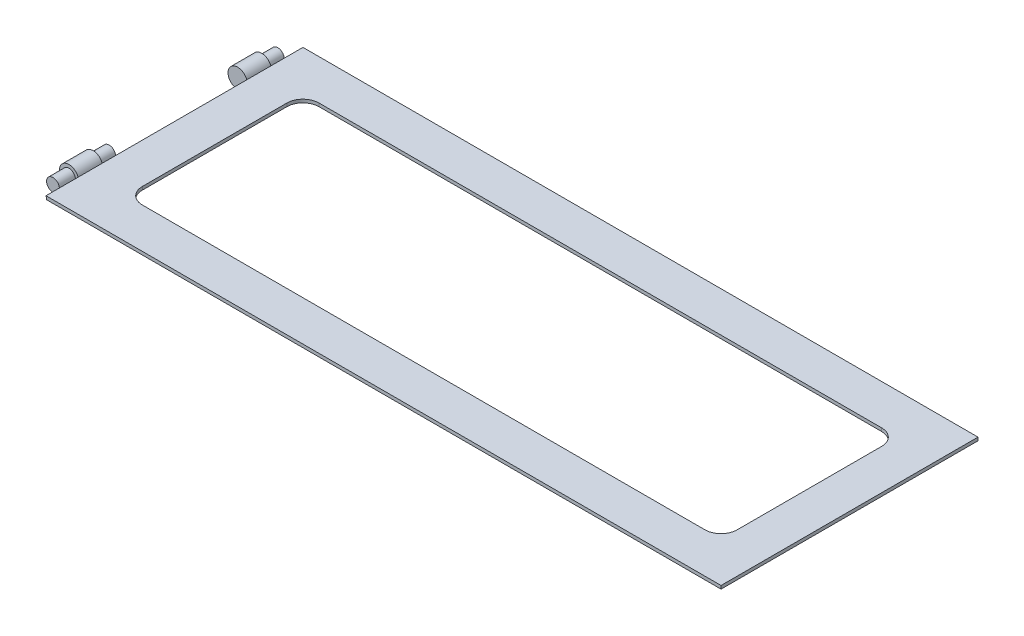
ISO-10303-21;
HEADER;
FILE_DESCRIPTION(('STEP AP214'),'2;1');
FILE_NAME('part.step','',(''),(''),'','','');
FILE_SCHEMA(('AUTOMOTIVE_DESIGN { 1 0 10303 214 1 1 1 1 }'));
ENDSEC;
DATA;
#1=APPLICATION_CONTEXT('core data for automotive mechanical design processes');
#2=APPLICATION_PROTOCOL_DEFINITION('international standard','automotive_design',2000,#1);
#3=PRODUCT_CONTEXT('',#1,'mechanical');
#4=PRODUCT('Part','Part','',(#3));
#5=PRODUCT_RELATED_PRODUCT_CATEGORY('part','',(#4));
#6=PRODUCT_DEFINITION_FORMATION('','',#4);
#7=PRODUCT_DEFINITION_CONTEXT('part definition',#1,'design');
#8=PRODUCT_DEFINITION('design','',#6,#7);
#9=PRODUCT_DEFINITION_SHAPE('','',#8);
#10=(LENGTH_UNIT() NAMED_UNIT(*) SI_UNIT(.MILLI.,.METRE.));
#11=(NAMED_UNIT(*) PLANE_ANGLE_UNIT() SI_UNIT($,.RADIAN.));
#12=(NAMED_UNIT(*) SI_UNIT($,.STERADIAN.) SOLID_ANGLE_UNIT());
#13=UNCERTAINTY_MEASURE_WITH_UNIT(LENGTH_MEASURE(1.E-05),#10,'distance_accuracy_value','');
#14=(GEOMETRIC_REPRESENTATION_CONTEXT(3) GLOBAL_UNCERTAINTY_ASSIGNED_CONTEXT((#13)) GLOBAL_UNIT_ASSIGNED_CONTEXT((#10,
#11,#12)) REPRESENTATION_CONTEXT('',''));
#15=CARTESIAN_POINT('',(0.,0.,0.));
#16=DIRECTION('',(0.,0.,1.));
#17=DIRECTION('',(1.,0.,0.));
#18=AXIS2_PLACEMENT_3D('',#15,#16,#17);
#19=CARTESIAN_POINT('',(0.,1.,-80.));
#20=DIRECTION('',(0.,-1.,0.));
#21=DIRECTION('',(0.,0.,-1.));
#22=AXIS2_PLACEMENT_3D('',#19,#20,#21);
#23=PLANE('',#22);
#24=DIRECTION('',(1.,0.,0.));
#25=VECTOR('',#24,1.);
#26=CARTESIAN_POINT('',(0.,1.,0.));
#27=LINE('',#26,#25);
#28=CARTESIAN_POINT('',(2.82842712474619,1.,0.));
#29=VERTEX_POINT('',#28);
#30=CARTESIAN_POINT('',(213.,1.,0.));
#31=VERTEX_POINT('',#30);
#32=EDGE_CURVE('E171',#29,#31,#27,.T.);
#33=ORIENTED_EDGE('',*,*,#32,.T.);
#34=DIRECTION('',(0.,0.,1.));
#35=VECTOR('',#34,1.);
#36=CARTESIAN_POINT('',(213.,1.,-80.));
#37=LINE('',#36,#35);
#38=CARTESIAN_POINT('',(213.,1.,-80.));
#39=VERTEX_POINT('',#38);
#40=EDGE_CURVE('E181',#39,#31,#37,.T.);
#41=ORIENTED_EDGE('',*,*,#40,.F.);
#42=DIRECTION('',(1.,0.,0.));
#43=VECTOR('',#42,1.);
#44=CARTESIAN_POINT('',(0.,1.,-80.));
#45=LINE('',#44,#43);
#46=CARTESIAN_POINT('',(2.82842712474619,1.,-80.));
#47=VERTEX_POINT('',#46);
#48=EDGE_CURVE('E189',#47,#39,#45,.T.);
#49=ORIENTED_EDGE('',*,*,#48,.F.);
#50=DIRECTION('',(0.,0.,1.));
#51=VECTOR('',#50,1.);
#52=CARTESIAN_POINT('',(2.82842712474619,1.,-80.));
#53=LINE('',#52,#51);
#54=CARTESIAN_POINT('',(2.82842712474619,1.,-70.));
#55=VERTEX_POINT('',#54);
#56=EDGE_CURVE('E157',#47,#55,#53,.T.);
#57=ORIENTED_EDGE('',*,*,#56,.T.);
#58=CARTESIAN_POINT('',(2.82842712474619,1.,-62.5));
#59=VERTEX_POINT('',#58);
#60=EDGE_CURVE('E209',#55,#59,#53,.T.);
#61=ORIENTED_EDGE('',*,*,#60,.T.);
#62=DIRECTION('',(0.,0.,1.));
#63=VECTOR('',#62,1.);
#64=CARTESIAN_POINT('',(2.82842712474619,1.,-22.5));
#65=LINE('',#64,#63);
#66=CARTESIAN_POINT('',(2.82842712474619,1.,-17.5));
#67=VERTEX_POINT('',#66);
#68=EDGE_CURVE('E221',#59,#67,#65,.T.);
#69=ORIENTED_EDGE('',*,*,#68,.T.);
#70=CARTESIAN_POINT('',(2.82842712474619,1.,-10.));
#71=VERTEX_POINT('',#70);
#72=EDGE_CURVE('E210',#67,#71,#53,.T.);
#73=ORIENTED_EDGE('',*,*,#72,.T.);
#74=DIRECTION('',(0.,0.,1.));
#75=VECTOR('',#74,1.);
#76=CARTESIAN_POINT('',(2.82842712474619,1.,-5.));
#77=LINE('',#76,#75);
#78=EDGE_CURVE('E202',#71,#29,#77,.T.);
#79=ORIENTED_EDGE('',*,*,#78,.T.);
#80=EDGE_LOOP('',(#33,#41,#49,#57,#61,#69,#73,#79));
#81=FACE_BOUND('',#80,.T.);
#82=DIRECTION('',(0.,0.,1.));
#83=VECTOR('',#82,1.);
#84=CARTESIAN_POINT('',(200.5,1.,-67.5));
#85=LINE('',#84,#83);
#86=CARTESIAN_POINT('',(200.5,1.,-62.5));
#87=VERTEX_POINT('',#86);
#88=CARTESIAN_POINT('',(200.5,1.,-17.5));
#89=VERTEX_POINT('',#88);
#90=EDGE_CURVE('E162',#87,#89,#85,.T.);
#91=ORIENTED_EDGE('',*,*,#90,.T.);
#92=CARTESIAN_POINT('',(195.5,1.,-17.5));
#93=DIRECTION('',(0.,-1.,0.));
#94=DIRECTION('',(0.,0.,-1.));
#95=AXIS2_PLACEMENT_3D('',#92,#93,#94);
#96=CIRCLE('',#95,5.);
#97=CARTESIAN_POINT('',(195.5,1.,-12.5));
#98=VERTEX_POINT('',#97);
#99=EDGE_CURVE('E331',#89,#98,#96,.T.);
#100=ORIENTED_EDGE('',*,*,#99,.T.);
#101=DIRECTION('',(-1.,0.,0.));
#102=VECTOR('',#101,1.);
#103=CARTESIAN_POINT('',(200.5,1.,-12.5));
#104=LINE('',#103,#102);
#105=CARTESIAN_POINT('',(20.3284271247462,1.,-12.5));
#106=VERTEX_POINT('',#105);
#107=EDGE_CURVE('E367',#98,#106,#104,.T.);
#108=ORIENTED_EDGE('',*,*,#107,.T.);
#109=CARTESIAN_POINT('',(20.3284271247462,1.,-17.5));
#110=DIRECTION('',(0.,-1.,0.));
#111=DIRECTION('',(0.,0.,-1.));
#112=AXIS2_PLACEMENT_3D('',#109,#110,#111);
#113=CIRCLE('',#112,5.);
#114=CARTESIAN_POINT('',(15.3284271247462,1.,-17.5));
#115=VERTEX_POINT('',#114);
#116=EDGE_CURVE('E321',#106,#115,#113,.T.);
#117=ORIENTED_EDGE('',*,*,#116,.T.);
#118=DIRECTION('',(0.,0.,1.));
#119=VECTOR('',#118,1.);
#120=CARTESIAN_POINT('',(15.3284271247462,1.,-67.5));
#121=LINE('',#120,#119);
#122=CARTESIAN_POINT('',(15.3284271247462,1.,-62.5));
#123=VERTEX_POINT('',#122);
#124=EDGE_CURVE('E370',#123,#115,#121,.T.);
#125=ORIENTED_EDGE('',*,*,#124,.F.);
#126=CARTESIAN_POINT('',(20.3284271247462,1.,-62.5));
#127=DIRECTION('',(0.,-1.,0.));
#128=DIRECTION('',(0.,0.,-1.));
#129=AXIS2_PLACEMENT_3D('',#126,#127,#128);
#130=CIRCLE('',#129,5.);
#131=CARTESIAN_POINT('',(20.3284271247462,1.,-67.5));
#132=VERTEX_POINT('',#131);
#133=EDGE_CURVE('E46',#123,#132,#130,.T.);
#134=ORIENTED_EDGE('',*,*,#133,.T.);
#135=DIRECTION('',(-1.,0.,0.));
#136=VECTOR('',#135,1.);
#137=CARTESIAN_POINT('',(200.5,1.,-67.5));
#138=LINE('',#137,#136);
#139=CARTESIAN_POINT('',(195.5,1.,-67.5));
#140=VERTEX_POINT('',#139);
#141=EDGE_CURVE('E372',#140,#132,#138,.T.);
#142=ORIENTED_EDGE('',*,*,#141,.F.);
#143=CARTESIAN_POINT('',(195.5,1.,-62.5));
#144=DIRECTION('',(0.,-1.,0.));
#145=DIRECTION('',(0.,0.,-1.));
#146=AXIS2_PLACEMENT_3D('',#143,#144,#145);
#147=CIRCLE('',#146,5.);
#148=EDGE_CURVE('E327',#140,#87,#147,.T.);
#149=ORIENTED_EDGE('',*,*,#148,.T.);
#150=EDGE_LOOP('',(#91,#100,#108,#117,#125,#134,#142,#149));
#151=FACE_BOUND('',#150,.T.);
#152=ADVANCED_FACE('F38',(#81,#151),#23,.F.);
#153=CARTESIAN_POINT('',(0.,0.,-80.));
#154=DIRECTION('',(0.,1.,0.));
#155=DIRECTION('',(-1.,0.,0.));
#156=AXIS2_PLACEMENT_3D('',#153,#154,#155);
#157=PLANE('',#156);
#158=DIRECTION('',(-1.,0.,0.));
#159=VECTOR('',#158,1.);
#160=CARTESIAN_POINT('',(0.,0.,0.));
#161=LINE('',#160,#159);
#162=CARTESIAN_POINT('',(213.,0.,0.));
#163=VERTEX_POINT('',#162);
#164=CARTESIAN_POINT('',(3.,0.,0.));
#165=VERTEX_POINT('',#164);
#166=EDGE_CURVE('E199',#163,#165,#161,.T.);
#167=ORIENTED_EDGE('',*,*,#166,.T.);
#168=DIRECTION('',(0.,0.,1.));
#169=VECTOR('',#168,1.);
#170=CARTESIAN_POINT('',(3.,0.,-5.));
#171=LINE('',#170,#169);
#172=CARTESIAN_POINT('',(3.,0.,-10.));
#173=VERTEX_POINT('',#172);
#174=EDGE_CURVE('E262',#165,#173,#171,.F.);
#175=ORIENTED_EDGE('',*,*,#174,.T.);
#176=DIRECTION('',(0.,0.,1.));
#177=VECTOR('',#176,1.);
#178=CARTESIAN_POINT('',(3.,0.,-80.));
#179=LINE('',#178,#177);
#180=CARTESIAN_POINT('',(3.,0.,-17.5));
#181=VERTEX_POINT('',#180);
#182=EDGE_CURVE('E183',#181,#173,#179,.T.);
#183=ORIENTED_EDGE('',*,*,#182,.F.);
#184=CARTESIAN_POINT('',(3.,0.,-62.5));
#185=VERTEX_POINT('',#184);
#186=EDGE_CURVE('E180',#185,#181,#179,.T.);
#187=ORIENTED_EDGE('',*,*,#186,.F.);
#188=CARTESIAN_POINT('',(3.,0.,-70.));
#189=VERTEX_POINT('',#188);
#190=EDGE_CURVE('E177',#189,#185,#179,.T.);
#191=ORIENTED_EDGE('',*,*,#190,.F.);
#192=CARTESIAN_POINT('',(3.,0.,-80.));
#193=VERTEX_POINT('',#192);
#194=EDGE_CURVE('E155',#193,#189,#179,.T.);
#195=ORIENTED_EDGE('',*,*,#194,.F.);
#196=DIRECTION('',(-1.,0.,0.));
#197=VECTOR('',#196,1.);
#198=CARTESIAN_POINT('',(0.,0.,-80.));
#199=LINE('',#198,#197);
#200=CARTESIAN_POINT('',(213.,0.,-80.));
#201=VERTEX_POINT('',#200);
#202=EDGE_CURVE('E165',#201,#193,#199,.T.);
#203=ORIENTED_EDGE('',*,*,#202,.F.);
#204=DIRECTION('',(0.,0.,1.));
#205=VECTOR('',#204,1.);
#206=CARTESIAN_POINT('',(213.,0.,-80.));
#207=LINE('',#206,#205);
#208=EDGE_CURVE('E178',#201,#163,#207,.T.);
#209=ORIENTED_EDGE('',*,*,#208,.T.);
#210=EDGE_LOOP('',(#167,#175,#183,#187,#191,#195,#203,#209));
#211=FACE_BOUND('',#210,.T.);
#212=DIRECTION('',(-1.,0.,0.));
#213=VECTOR('',#212,1.);
#214=CARTESIAN_POINT('',(0.,0.,-12.5));
#215=LINE('',#214,#213);
#216=CARTESIAN_POINT('',(195.5,0.,-12.5));
#217=VERTEX_POINT('',#216);
#218=CARTESIAN_POINT('',(20.3284271247462,0.,-12.5));
#219=VERTEX_POINT('',#218);
#220=EDGE_CURVE('E350',#217,#219,#215,.T.);
#221=ORIENTED_EDGE('',*,*,#220,.F.);
#222=CARTESIAN_POINT('',(195.5,0.,-17.5));
#223=DIRECTION('',(0.,1.,0.));
#224=DIRECTION('',(-1.,0.,0.));
#225=AXIS2_PLACEMENT_3D('',#222,#223,#224);
#226=CIRCLE('',#225,5.);
#227=CARTESIAN_POINT('',(200.5,0.,-17.5));
#228=VERTEX_POINT('',#227);
#229=EDGE_CURVE('E329',#217,#228,#226,.T.);
#230=ORIENTED_EDGE('',*,*,#229,.T.);
#231=DIRECTION('',(0.,0.,1.));
#232=VECTOR('',#231,1.);
#233=CARTESIAN_POINT('',(200.5,0.,-80.));
#234=LINE('',#233,#232);
#235=CARTESIAN_POINT('',(200.5,0.,-62.5));
#236=VERTEX_POINT('',#235);
#237=EDGE_CURVE('E208',#236,#228,#234,.T.);
#238=ORIENTED_EDGE('',*,*,#237,.F.);
#239=CARTESIAN_POINT('',(195.5,0.,-62.5));
#240=DIRECTION('',(0.,1.,0.));
#241=DIRECTION('',(-1.,0.,0.));
#242=AXIS2_PLACEMENT_3D('',#239,#240,#241);
#243=CIRCLE('',#242,5.);
#244=CARTESIAN_POINT('',(195.5,0.,-67.5));
#245=VERTEX_POINT('',#244);
#246=EDGE_CURVE('E323',#236,#245,#243,.T.);
#247=ORIENTED_EDGE('',*,*,#246,.T.);
#248=DIRECTION('',(-1.,0.,0.));
#249=VECTOR('',#248,1.);
#250=CARTESIAN_POINT('',(0.,0.,-67.5));
#251=LINE('',#250,#249);
#252=CARTESIAN_POINT('',(20.3284271247462,0.,-67.5));
#253=VERTEX_POINT('',#252);
#254=EDGE_CURVE('E354',#245,#253,#251,.T.);
#255=ORIENTED_EDGE('',*,*,#254,.T.);
#256=CARTESIAN_POINT('',(20.3284271247462,0.,-62.5));
#257=DIRECTION('',(0.,1.,0.));
#258=DIRECTION('',(-1.,0.,0.));
#259=AXIS2_PLACEMENT_3D('',#256,#257,#258);
#260=CIRCLE('',#259,5.);
#261=CARTESIAN_POINT('',(15.3284271247462,0.,-62.5));
#262=VERTEX_POINT('',#261);
#263=EDGE_CURVE('E11',#253,#262,#260,.T.);
#264=ORIENTED_EDGE('',*,*,#263,.T.);
#265=DIRECTION('',(0.,0.,1.));
#266=VECTOR('',#265,1.);
#267=CARTESIAN_POINT('',(15.3284271247462,0.,-80.));
#268=LINE('',#267,#266);
#269=CARTESIAN_POINT('',(15.3284271247462,0.,-17.5));
#270=VERTEX_POINT('',#269);
#271=EDGE_CURVE('E352',#262,#270,#268,.T.);
#272=ORIENTED_EDGE('',*,*,#271,.T.);
#273=CARTESIAN_POINT('',(20.3284271247462,0.,-17.5));
#274=DIRECTION('',(0.,1.,0.));
#275=DIRECTION('',(-1.,0.,0.));
#276=AXIS2_PLACEMENT_3D('',#273,#274,#275);
#277=CIRCLE('',#276,5.);
#278=EDGE_CURVE('E316',#270,#219,#277,.T.);
#279=ORIENTED_EDGE('',*,*,#278,.T.);
#280=EDGE_LOOP('',(#221,#230,#238,#247,#255,#264,#272,#279));
#281=FACE_BOUND('',#280,.T.);
#282=ADVANCED_FACE('F175',(#211,#281),#157,.F.);
#283=CARTESIAN_POINT('',(0.,0.,-80.));
#284=DIRECTION('',(0.,0.,1.));
#285=DIRECTION('',(1.,0.,0.));
#286=AXIS2_PLACEMENT_3D('',#283,#284,#285);
#287=CYLINDRICAL_SURFACE('',#286,3.);
#288=CARTESIAN_POINT('',(0.,0.,-70.));
#289=DIRECTION('',(0.,0.,1.));
#290=DIRECTION('',(1.,0.,0.));
#291=AXIS2_PLACEMENT_3D('',#288,#289,#290);
#292=CIRCLE('',#291,3.);
#293=EDGE_CURVE('E240',#55,#189,#292,.T.);
#294=ORIENTED_EDGE('',*,*,#293,.T.);
#295=ORIENTED_EDGE('',*,*,#190,.T.);
#296=CARTESIAN_POINT('',(0.,0.,-62.5));
#297=DIRECTION('',(0.,0.,1.));
#298=DIRECTION('',(1.,0.,0.));
#299=AXIS2_PLACEMENT_3D('',#296,#297,#298);
#300=CIRCLE('',#299,3.);
#301=EDGE_CURVE('E235',#59,#185,#300,.T.);
#302=ORIENTED_EDGE('',*,*,#301,.F.);
#303=ORIENTED_EDGE('',*,*,#60,.F.);
#304=EDGE_LOOP('',(#294,#295,#302,#303));
#305=FACE_BOUND('',#304,.T.);
#306=ADVANCED_FACE('F238',(#305),#287,.T.);
#307=CARTESIAN_POINT('',(0.,0.,-17.5));
#308=DIRECTION('',(0.,0.,1.));
#309=DIRECTION('',(1.,0.,0.));
#310=AXIS2_PLACEMENT_3D('',#307,#308,#309);
#311=CIRCLE('',#310,3.);
#312=EDGE_CURVE('E249',#67,#181,#311,.T.);
#313=ORIENTED_EDGE('',*,*,#312,.T.);
#314=ORIENTED_EDGE('',*,*,#182,.T.);
#315=CARTESIAN_POINT('',(0.,0.,-10.));
#316=DIRECTION('',(0.,0.,1.));
#317=DIRECTION('',(1.,0.,0.));
#318=AXIS2_PLACEMENT_3D('',#315,#316,#317);
#319=CIRCLE('',#318,3.);
#320=EDGE_CURVE('E254',#71,#173,#319,.T.);
#321=ORIENTED_EDGE('',*,*,#320,.F.);
#322=ORIENTED_EDGE('',*,*,#72,.F.);
#323=EDGE_LOOP('',(#313,#314,#321,#322));
#324=FACE_BOUND('',#323,.T.);
#325=ADVANCED_FACE('F295',(#324),#287,.T.);
#326=CARTESIAN_POINT('',(213.,0.,-80.));
#327=DIRECTION('',(-1.,0.,0.));
#328=DIRECTION('',(0.,0.,1.));
#329=AXIS2_PLACEMENT_3D('',#326,#327,#328);
#330=PLANE('',#329);
#331=DIRECTION('',(0.,-1.,0.));
#332=VECTOR('',#331,1.);
#333=CARTESIAN_POINT('',(213.,0.,0.));
#334=LINE('',#333,#332);
#335=EDGE_CURVE('E201',#31,#163,#334,.T.);
#336=ORIENTED_EDGE('',*,*,#335,.T.);
#337=ORIENTED_EDGE('',*,*,#208,.F.);
#338=DIRECTION('',(0.,-1.,0.));
#339=VECTOR('',#338,1.);
#340=CARTESIAN_POINT('',(213.,0.,-80.));
#341=LINE('',#340,#339);
#342=EDGE_CURVE('E167',#39,#201,#341,.T.);
#343=ORIENTED_EDGE('',*,*,#342,.F.);
#344=ORIENTED_EDGE('',*,*,#40,.T.);
#345=EDGE_LOOP('',(#336,#337,#343,#344));
#346=FACE_BOUND('',#345,.T.);
#347=ADVANCED_FACE('F270',(#346),#330,.F.);
#348=CARTESIAN_POINT('',(0.,0.,-80.));
#349=DIRECTION('',(0.,0.,1.));
#350=DIRECTION('',(1.,0.,0.));
#351=AXIS2_PLACEMENT_3D('',#348,#349,#350);
#352=PLANE('',#351);
#353=ORIENTED_EDGE('',*,*,#202,.T.);
#354=CARTESIAN_POINT('',(0.,0.,-80.));
#355=DIRECTION('',(0.,0.,1.));
#356=DIRECTION('',(1.,0.,0.));
#357=AXIS2_PLACEMENT_3D('',#354,#355,#356);
#358=CIRCLE('',#357,3.);
#359=EDGE_CURVE('E150',#193,#47,#358,.T.);
#360=ORIENTED_EDGE('',*,*,#359,.T.);
#361=ORIENTED_EDGE('',*,*,#48,.T.);
#362=ORIENTED_EDGE('',*,*,#342,.T.);
#363=EDGE_LOOP('',(#353,#360,#361,#362));
#364=FACE_BOUND('',#363,.T.);
#365=ADVANCED_FACE('F166',(#364),#352,.F.);
#366=CARTESIAN_POINT('',(0.,0.,0.));
#367=DIRECTION('',(0.,0.,1.));
#368=DIRECTION('',(1.,0.,0.));
#369=AXIS2_PLACEMENT_3D('',#366,#367,#368);
#370=PLANE('',#369);
#371=CARTESIAN_POINT('',(0.,0.,0.));
#372=DIRECTION('',(0.,0.,1.));
#373=DIRECTION('',(1.,0.,0.));
#374=AXIS2_PLACEMENT_3D('',#371,#372,#373);
#375=CIRCLE('',#374,3.);
#376=EDGE_CURVE('E258',#165,#29,#375,.T.);
#377=ORIENTED_EDGE('',*,*,#376,.F.);
#378=ORIENTED_EDGE('',*,*,#166,.F.);
#379=ORIENTED_EDGE('',*,*,#335,.F.);
#380=ORIENTED_EDGE('',*,*,#32,.F.);
#381=EDGE_LOOP('',(#377,#378,#379,#380));
#382=FACE_BOUND('',#381,.T.);
#383=ADVANCED_FACE('F269',(#382),#370,.T.);
#384=CARTESIAN_POINT('',(0.,0.,-5.));
#385=DIRECTION('',(0.,0.,1.));
#386=DIRECTION('',(1.,0.,0.));
#387=AXIS2_PLACEMENT_3D('',#384,#385,#386);
#388=CYLINDRICAL_SURFACE('',#387,3.);
#389=ORIENTED_EDGE('',*,*,#78,.F.);
#390=EDGE_CURVE('E255',#173,#71,#319,.T.);
#391=ORIENTED_EDGE('',*,*,#390,.F.);
#392=ORIENTED_EDGE('',*,*,#174,.F.);
#393=ORIENTED_EDGE('',*,*,#376,.T.);
#394=EDGE_LOOP('',(#389,#391,#392,#393));
#395=FACE_BOUND('',#394,.T.);
#396=ADVANCED_FACE('F274',(#395),#388,.F.);
#397=CARTESIAN_POINT('',(0.,0.,-10.));
#398=DIRECTION('',(0.,0.,1.));
#399=DIRECTION('',(1.,0.,0.));
#400=AXIS2_PLACEMENT_3D('',#397,#398,#399);
#401=CYLINDRICAL_SURFACE('',#400,2.);
#402=CARTESIAN_POINT('',(0.,0.,-10.));
#403=DIRECTION('',(0.,0.,1.));
#404=DIRECTION('',(1.,0.,0.));
#405=AXIS2_PLACEMENT_3D('',#402,#403,#404);
#406=CIRCLE('',#405,2.);
#407=CARTESIAN_POINT('',(2.,0.,-10.));
#408=VERTEX_POINT('',#407);
#409=EDGE_CURVE('E251',#408,#408,#406,.T.);
#410=ORIENTED_EDGE('',*,*,#409,.T.);
#411=EDGE_LOOP('',(#410));
#412=FACE_BOUND('',#411,.T.);
#413=CARTESIAN_POINT('',(0.,0.,-5.));
#414=DIRECTION('',(0.,0.,1.));
#415=DIRECTION('',(1.,0.,0.));
#416=AXIS2_PLACEMENT_3D('',#413,#414,#415);
#417=CIRCLE('',#416,2.);
#418=CARTESIAN_POINT('',(2.,0.,-5.));
#419=VERTEX_POINT('',#418);
#420=EDGE_CURVE('E230',#419,#419,#417,.T.);
#421=ORIENTED_EDGE('',*,*,#420,.F.);
#422=EDGE_LOOP('',(#421));
#423=FACE_BOUND('',#422,.T.);
#424=ADVANCED_FACE('F276',(#412,#423),#401,.T.);
#425=CARTESIAN_POINT('',(0.,0.,-10.));
#426=DIRECTION('',(0.,0.,1.));
#427=DIRECTION('',(1.,0.,0.));
#428=AXIS2_PLACEMENT_3D('',#425,#426,#427);
#429=PLANE('',#428);
#430=ORIENTED_EDGE('',*,*,#409,.F.);
#431=EDGE_LOOP('',(#430));
#432=FACE_BOUND('',#431,.T.);
#433=ORIENTED_EDGE('',*,*,#390,.T.);
#434=ORIENTED_EDGE('',*,*,#320,.T.);
#435=EDGE_LOOP('',(#433,#434));
#436=FACE_BOUND('',#435,.T.);
#437=ADVANCED_FACE('F273',(#432,#436),#429,.T.);
#438=CARTESIAN_POINT('',(0.,0.,-5.));
#439=DIRECTION('',(0.,0.,1.));
#440=DIRECTION('',(1.,0.,0.));
#441=AXIS2_PLACEMENT_3D('',#438,#439,#440);
#442=PLANE('',#441);
#443=ORIENTED_EDGE('',*,*,#420,.T.);
#444=EDGE_LOOP('',(#443));
#445=FACE_BOUND('',#444,.T.);
#446=ADVANCED_FACE('F414',(#445),#442,.T.);
#447=CARTESIAN_POINT('',(0.,0.,-22.5));
#448=DIRECTION('',(0.,0.,1.));
#449=DIRECTION('',(1.,0.,0.));
#450=AXIS2_PLACEMENT_3D('',#447,#448,#449);
#451=CYLINDRICAL_SURFACE('',#450,3.);
#452=ORIENTED_EDGE('',*,*,#68,.F.);
#453=EDGE_CURVE('E228',#185,#59,#300,.T.);
#454=ORIENTED_EDGE('',*,*,#453,.F.);
#455=ORIENTED_EDGE('',*,*,#186,.T.);
#456=EDGE_CURVE('E229',#181,#67,#311,.T.);
#457=ORIENTED_EDGE('',*,*,#456,.T.);
#458=EDGE_LOOP('',(#452,#454,#455,#457));
#459=FACE_BOUND('',#458,.T.);
#460=ADVANCED_FACE('F227',(#459),#451,.F.);
#461=CARTESIAN_POINT('',(0.,0.,-22.5));
#462=DIRECTION('',(0.,0.,1.));
#463=DIRECTION('',(1.,0.,0.));
#464=AXIS2_PLACEMENT_3D('',#461,#462,#463);
#465=CYLINDRICAL_SURFACE('',#464,2.);
#466=CARTESIAN_POINT('',(0.,0.,-22.5));
#467=DIRECTION('',(0.,0.,1.));
#468=DIRECTION('',(1.,0.,0.));
#469=AXIS2_PLACEMENT_3D('',#466,#467,#468);
#470=CIRCLE('',#469,2.);
#471=CARTESIAN_POINT('',(2.,0.,-22.5));
#472=VERTEX_POINT('',#471);
#473=EDGE_CURVE('E236',#472,#472,#470,.F.);
#474=ORIENTED_EDGE('',*,*,#473,.F.);
#475=EDGE_LOOP('',(#474));
#476=FACE_BOUND('',#475,.T.);
#477=CARTESIAN_POINT('',(0.,0.,-17.5));
#478=DIRECTION('',(0.,0.,1.));
#479=DIRECTION('',(1.,0.,0.));
#480=AXIS2_PLACEMENT_3D('',#477,#478,#479);
#481=CIRCLE('',#480,2.);
#482=CARTESIAN_POINT('',(2.,0.,-17.5));
#483=VERTEX_POINT('',#482);
#484=EDGE_CURVE('E246',#483,#483,#481,.T.);
#485=ORIENTED_EDGE('',*,*,#484,.F.);
#486=EDGE_LOOP('',(#485));
#487=FACE_BOUND('',#486,.T.);
#488=ADVANCED_FACE('F410',(#476,#487),#465,.T.);
#489=CARTESIAN_POINT('',(0.,0.,-17.5));
#490=DIRECTION('',(0.,0.,1.));
#491=DIRECTION('',(1.,0.,0.));
#492=AXIS2_PLACEMENT_3D('',#489,#490,#491);
#493=PLANE('',#492);
#494=ORIENTED_EDGE('',*,*,#484,.T.);
#495=EDGE_LOOP('',(#494));
#496=FACE_BOUND('',#495,.T.);
#497=ORIENTED_EDGE('',*,*,#456,.F.);
#498=ORIENTED_EDGE('',*,*,#312,.F.);
#499=EDGE_LOOP('',(#497,#498));
#500=FACE_BOUND('',#499,.T.);
#501=ADVANCED_FACE('F406',(#496,#500),#493,.F.);
#502=CARTESIAN_POINT('',(0.,0.,-22.5));
#503=DIRECTION('',(0.,0.,1.));
#504=DIRECTION('',(1.,0.,0.));
#505=AXIS2_PLACEMENT_3D('',#502,#503,#504);
#506=PLANE('',#505);
#507=ORIENTED_EDGE('',*,*,#473,.T.);
#508=EDGE_LOOP('',(#507));
#509=FACE_BOUND('',#508,.T.);
#510=ADVANCED_FACE('F403',(#509),#506,.F.);
#511=CARTESIAN_POINT('',(0.,0.,-62.5));
#512=DIRECTION('',(0.,0.,1.));
#513=DIRECTION('',(1.,0.,0.));
#514=AXIS2_PLACEMENT_3D('',#511,#512,#513);
#515=PLANE('',#514);
#516=ORIENTED_EDGE('',*,*,#453,.T.);
#517=ORIENTED_EDGE('',*,*,#301,.T.);
#518=EDGE_LOOP('',(#516,#517));
#519=FACE_BOUND('',#518,.T.);
#520=ADVANCED_FACE('F234',(#519),#515,.T.);
#521=CARTESIAN_POINT('',(0.,0.,-75.));
#522=DIRECTION('',(0.,0.,1.));
#523=DIRECTION('',(1.,0.,0.));
#524=AXIS2_PLACEMENT_3D('',#521,#522,#523);
#525=CYLINDRICAL_SURFACE('',#524,3.);
#526=EDGE_CURVE('E239',#189,#55,#292,.T.);
#527=ORIENTED_EDGE('',*,*,#526,.T.);
#528=ORIENTED_EDGE('',*,*,#56,.F.);
#529=ORIENTED_EDGE('',*,*,#359,.F.);
#530=ORIENTED_EDGE('',*,*,#194,.T.);
#531=EDGE_LOOP('',(#527,#528,#529,#530));
#532=FACE_BOUND('',#531,.T.);
#533=ADVANCED_FACE('F153',(#532),#525,.F.);
#534=CARTESIAN_POINT('',(0.,0.,-75.));
#535=DIRECTION('',(0.,0.,1.));
#536=DIRECTION('',(1.,0.,0.));
#537=AXIS2_PLACEMENT_3D('',#534,#535,#536);
#538=CYLINDRICAL_SURFACE('',#537,2.);
#539=CARTESIAN_POINT('',(0.,0.,-75.));
#540=DIRECTION('',(0.,0.,1.));
#541=DIRECTION('',(1.,0.,0.));
#542=AXIS2_PLACEMENT_3D('',#539,#540,#541);
#543=CIRCLE('',#542,2.);
#544=CARTESIAN_POINT('',(2.,0.,-75.));
#545=VERTEX_POINT('',#544);
#546=EDGE_CURVE('E161',#545,#545,#543,.F.);
#547=ORIENTED_EDGE('',*,*,#546,.F.);
#548=EDGE_LOOP('',(#547));
#549=FACE_BOUND('',#548,.T.);
#550=CARTESIAN_POINT('',(0.,0.,-70.));
#551=DIRECTION('',(0.,0.,1.));
#552=DIRECTION('',(1.,0.,0.));
#553=AXIS2_PLACEMENT_3D('',#550,#551,#552);
#554=CIRCLE('',#553,2.);
#555=CARTESIAN_POINT('',(2.,0.,-70.));
#556=VERTEX_POINT('',#555);
#557=EDGE_CURVE('E379',#556,#556,#554,.T.);
#558=ORIENTED_EDGE('',*,*,#557,.F.);
#559=EDGE_LOOP('',(#558));
#560=FACE_BOUND('',#559,.T.);
#561=ADVANCED_FACE('F387',(#549,#560),#538,.T.);
#562=CARTESIAN_POINT('',(0.,0.,-70.));
#563=DIRECTION('',(0.,0.,1.));
#564=DIRECTION('',(1.,0.,0.));
#565=AXIS2_PLACEMENT_3D('',#562,#563,#564);
#566=PLANE('',#565);
#567=ORIENTED_EDGE('',*,*,#557,.T.);
#568=EDGE_LOOP('',(#567));
#569=FACE_BOUND('',#568,.T.);
#570=ORIENTED_EDGE('',*,*,#526,.F.);
#571=ORIENTED_EDGE('',*,*,#293,.F.);
#572=EDGE_LOOP('',(#570,#571));
#573=FACE_BOUND('',#572,.T.);
#574=ADVANCED_FACE('F384',(#569,#573),#566,.F.);
#575=CARTESIAN_POINT('',(0.,0.,-75.));
#576=DIRECTION('',(0.,0.,1.));
#577=DIRECTION('',(1.,0.,0.));
#578=AXIS2_PLACEMENT_3D('',#575,#576,#577);
#579=PLANE('',#578);
#580=ORIENTED_EDGE('',*,*,#546,.T.);
#581=EDGE_LOOP('',(#580));
#582=FACE_BOUND('',#581,.T.);
#583=ADVANCED_FACE('F386',(#582),#579,.F.);
#584=CARTESIAN_POINT('',(200.5,-3.,-12.5));
#585=DIRECTION('',(0.,0.,-1.));
#586=DIRECTION('',(-1.,0.,0.));
#587=AXIS2_PLACEMENT_3D('',#584,#585,#586);
#588=PLANE('',#587);
#589=ORIENTED_EDGE('',*,*,#107,.F.);
#590=DIRECTION('',(0.,1.,0.));
#591=VECTOR('',#590,1.);
#592=CARTESIAN_POINT('',(195.5,0.,-12.5));
#593=LINE('',#592,#591);
#594=EDGE_CURVE('E342',#98,#217,#593,.F.);
#595=ORIENTED_EDGE('',*,*,#594,.T.);
#596=ORIENTED_EDGE('',*,*,#220,.T.);
#597=DIRECTION('',(0.,1.,0.));
#598=VECTOR('',#597,1.);
#599=CARTESIAN_POINT('',(20.3284271247462,-3.,-12.5));
#600=LINE('',#599,#598);
#601=EDGE_CURVE('E318',#219,#106,#600,.T.);
#602=ORIENTED_EDGE('',*,*,#601,.T.);
#603=EDGE_LOOP('',(#589,#595,#596,#602));
#604=FACE_BOUND('',#603,.T.);
#605=ADVANCED_FACE('F369',(#604),#588,.T.);
#606=CARTESIAN_POINT('',(15.3284271247462,-3.,-67.5));
#607=DIRECTION('',(-1.,0.,0.));
#608=DIRECTION('',(0.,0.,1.));
#609=AXIS2_PLACEMENT_3D('',#606,#607,#608);
#610=PLANE('',#609);
#611=ORIENTED_EDGE('',*,*,#124,.T.);
#612=DIRECTION('',(0.,1.,0.));
#613=VECTOR('',#612,1.);
#614=CARTESIAN_POINT('',(15.3284271247462,-3.,-17.5));
#615=LINE('',#614,#613);
#616=EDGE_CURVE('E53',#115,#270,#615,.F.);
#617=ORIENTED_EDGE('',*,*,#616,.T.);
#618=ORIENTED_EDGE('',*,*,#271,.F.);
#619=DIRECTION('',(0.,1.,0.));
#620=VECTOR('',#619,1.);
#621=CARTESIAN_POINT('',(15.3284271247462,1.,-62.5));
#622=LINE('',#621,#620);
#623=EDGE_CURVE('E334',#262,#123,#622,.T.);
#624=ORIENTED_EDGE('',*,*,#623,.T.);
#625=EDGE_LOOP('',(#611,#617,#618,#624));
#626=FACE_BOUND('',#625,.T.);
#627=ADVANCED_FACE('F560',(#626),#610,.F.);
#628=CARTESIAN_POINT('',(200.5,-3.,-67.5));
#629=DIRECTION('',(0.,0.,-1.));
#630=DIRECTION('',(-1.,0.,0.));
#631=AXIS2_PLACEMENT_3D('',#628,#629,#630);
#632=PLANE('',#631);
#633=ORIENTED_EDGE('',*,*,#254,.F.);
#634=DIRECTION('',(0.,1.,0.));
#635=VECTOR('',#634,1.);
#636=CARTESIAN_POINT('',(195.5,-3.,-67.5));
#637=LINE('',#636,#635);
#638=EDGE_CURVE('E337',#245,#140,#637,.T.);
#639=ORIENTED_EDGE('',*,*,#638,.T.);
#640=ORIENTED_EDGE('',*,*,#141,.T.);
#641=DIRECTION('',(0.,1.,0.));
#642=VECTOR('',#641,1.);
#643=CARTESIAN_POINT('',(20.3284271247462,0.,-67.5));
#644=LINE('',#643,#642);
#645=EDGE_CURVE('E340',#132,#253,#644,.F.);
#646=ORIENTED_EDGE('',*,*,#645,.T.);
#647=EDGE_LOOP('',(#633,#639,#640,#646));
#648=FACE_BOUND('',#647,.T.);
#649=ADVANCED_FACE('F568',(#648),#632,.F.);
#650=CARTESIAN_POINT('',(200.5,-3.,-67.5));
#651=DIRECTION('',(-1.,0.,0.));
#652=DIRECTION('',(0.,0.,1.));
#653=AXIS2_PLACEMENT_3D('',#650,#651,#652);
#654=PLANE('',#653);
#655=ORIENTED_EDGE('',*,*,#237,.T.);
#656=DIRECTION('',(0.,1.,0.));
#657=VECTOR('',#656,1.);
#658=CARTESIAN_POINT('',(200.5,1.,-17.5));
#659=LINE('',#658,#657);
#660=EDGE_CURVE('E345',#228,#89,#659,.T.);
#661=ORIENTED_EDGE('',*,*,#660,.T.);
#662=ORIENTED_EDGE('',*,*,#90,.F.);
#663=DIRECTION('',(0.,1.,0.));
#664=VECTOR('',#663,1.);
#665=CARTESIAN_POINT('',(200.5,-3.,-62.5));
#666=LINE('',#665,#664);
#667=EDGE_CURVE('E348',#87,#236,#666,.F.);
#668=ORIENTED_EDGE('',*,*,#667,.T.);
#669=EDGE_LOOP('',(#655,#661,#662,#668));
#670=FACE_BOUND('',#669,.T.);
#671=ADVANCED_FACE('F303',(#670),#654,.T.);
#672=CARTESIAN_POINT('',(195.5,-3.,-17.5));
#673=DIRECTION('',(0.,-1.,0.));
#674=DIRECTION('',(0.,0.,-1.));
#675=AXIS2_PLACEMENT_3D('',#672,#673,#674);
#676=CYLINDRICAL_SURFACE('',#675,5.);
#677=ORIENTED_EDGE('',*,*,#229,.F.);
#678=ORIENTED_EDGE('',*,*,#594,.F.);
#679=ORIENTED_EDGE('',*,*,#99,.F.);
#680=ORIENTED_EDGE('',*,*,#660,.F.);
#681=EDGE_LOOP('',(#677,#678,#679,#680));
#682=FACE_BOUND('',#681,.T.);
#683=ADVANCED_FACE('F299',(#682),#676,.F.);
#684=CARTESIAN_POINT('',(195.5,-3.,-62.5));
#685=DIRECTION('',(0.,1.,0.));
#686=DIRECTION('',(0.,0.,1.));
#687=AXIS2_PLACEMENT_3D('',#684,#685,#686);
#688=CYLINDRICAL_SURFACE('',#687,5.);
#689=ORIENTED_EDGE('',*,*,#246,.F.);
#690=ORIENTED_EDGE('',*,*,#667,.F.);
#691=ORIENTED_EDGE('',*,*,#148,.F.);
#692=ORIENTED_EDGE('',*,*,#638,.F.);
#693=EDGE_LOOP('',(#689,#690,#691,#692));
#694=FACE_BOUND('',#693,.T.);
#695=ADVANCED_FACE('F302',(#694),#688,.F.);
#696=CARTESIAN_POINT('',(20.3284271247462,-3.,-17.5));
#697=DIRECTION('',(0.,1.,0.));
#698=DIRECTION('',(0.,0.,1.));
#699=AXIS2_PLACEMENT_3D('',#696,#697,#698);
#700=CYLINDRICAL_SURFACE('',#699,5.);
#701=ORIENTED_EDGE('',*,*,#278,.F.);
#702=ORIENTED_EDGE('',*,*,#616,.F.);
#703=ORIENTED_EDGE('',*,*,#116,.F.);
#704=ORIENTED_EDGE('',*,*,#601,.F.);
#705=EDGE_LOOP('',(#701,#702,#703,#704));
#706=FACE_BOUND('',#705,.T.);
#707=ADVANCED_FACE('F306',(#706),#700,.F.);
#708=CARTESIAN_POINT('',(20.3284271247462,-3.,-62.5));
#709=DIRECTION('',(0.,-1.,0.));
#710=DIRECTION('',(0.,0.,-1.));
#711=AXIS2_PLACEMENT_3D('',#708,#709,#710);
#712=CYLINDRICAL_SURFACE('',#711,5.);
#713=ORIENTED_EDGE('',*,*,#263,.F.);
#714=ORIENTED_EDGE('',*,*,#645,.F.);
#715=ORIENTED_EDGE('',*,*,#133,.F.);
#716=ORIENTED_EDGE('',*,*,#623,.F.);
#717=EDGE_LOOP('',(#713,#714,#715,#716));
#718=FACE_BOUND('',#717,.T.);
#719=ADVANCED_FACE('F40',(#718),#712,.F.);
#720=CLOSED_SHELL('',(#152,#282,#306,#325,#347,#365,#383,#396,#424,#437,#446,#460,#488,#501,
#510,#520,#533,#561,#574,#583,#605,#627,#649,#671,#683,#695,#707,#719));
#721=MANIFOLD_SOLID_BREP('B2',#720);
#722=ADVANCED_BREP_SHAPE_REPRESENTATION('',(#18,#721),#14);
#723=SHAPE_DEFINITION_REPRESENTATION(#9,#722);
ENDSEC;
END-ISO-10303-21;
